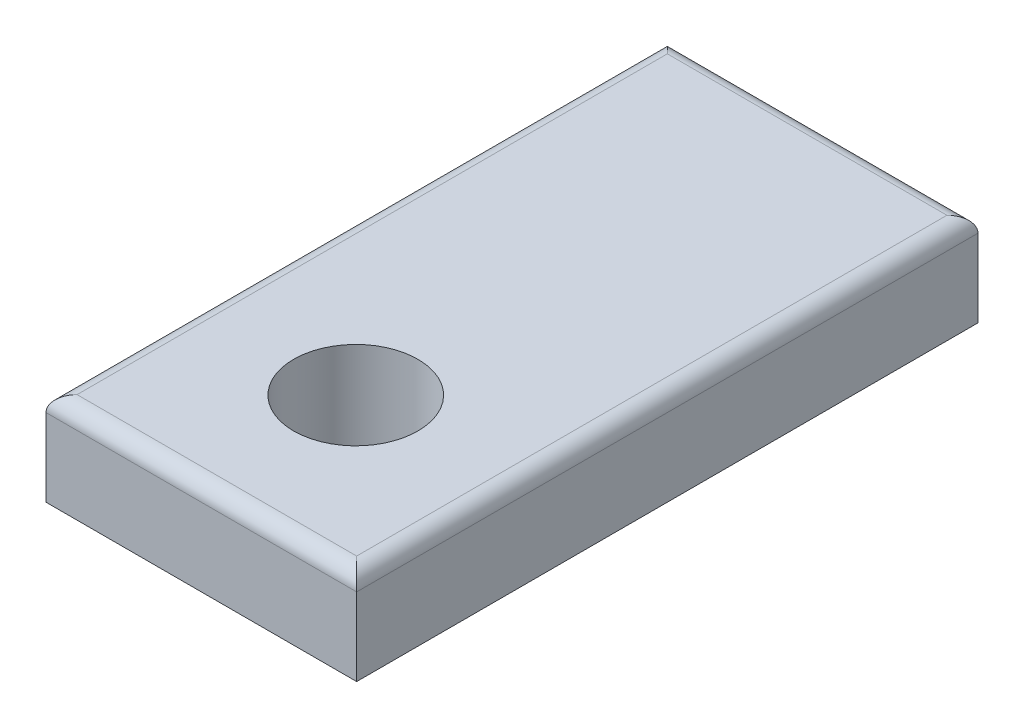
ISO-10303-21;
HEADER;
FILE_DESCRIPTION(('STEP AP214'),'2;1');
FILE_NAME('part.step','',(''),(''),'','','');
FILE_SCHEMA(('AUTOMOTIVE_DESIGN { 1 0 10303 214 1 1 1 1 }'));
ENDSEC;
DATA;
#1=APPLICATION_CONTEXT('core data for automotive mechanical design processes');
#2=APPLICATION_PROTOCOL_DEFINITION('international standard','automotive_design',2000,#1);
#3=PRODUCT_CONTEXT('',#1,'mechanical');
#4=PRODUCT('Part','Part','',(#3));
#5=PRODUCT_RELATED_PRODUCT_CATEGORY('part','',(#4));
#6=PRODUCT_DEFINITION_FORMATION('','',#4);
#7=PRODUCT_DEFINITION_CONTEXT('part definition',#1,'design');
#8=PRODUCT_DEFINITION('design','',#6,#7);
#9=PRODUCT_DEFINITION_SHAPE('','',#8);
#10=(LENGTH_UNIT() NAMED_UNIT(*) SI_UNIT(.MILLI.,.METRE.));
#11=(NAMED_UNIT(*) PLANE_ANGLE_UNIT() SI_UNIT($,.RADIAN.));
#12=(NAMED_UNIT(*) SI_UNIT($,.STERADIAN.) SOLID_ANGLE_UNIT());
#13=UNCERTAINTY_MEASURE_WITH_UNIT(LENGTH_MEASURE(1.E-05),#10,'distance_accuracy_value','');
#14=(GEOMETRIC_REPRESENTATION_CONTEXT(3) GLOBAL_UNCERTAINTY_ASSIGNED_CONTEXT((#13)) GLOBAL_UNIT_ASSIGNED_CONTEXT((#10,
#11,#12)) REPRESENTATION_CONTEXT('',''));
#15=CARTESIAN_POINT('',(0.,0.,0.));
#16=DIRECTION('',(0.,0.,1.));
#17=DIRECTION('',(1.,0.,0.));
#18=AXIS2_PLACEMENT_3D('',#15,#16,#17);
#19=CARTESIAN_POINT('',(5.,3.,10.));
#20=DIRECTION('',(-1.,0.,0.));
#21=DIRECTION('',(0.,0.,1.));
#22=AXIS2_PLACEMENT_3D('',#19,#20,#21);
#23=PLANE('',#22);
#24=DIRECTION('',(0.,-1.,0.));
#25=VECTOR('',#24,1.);
#26=CARTESIAN_POINT('',(5.,3.,-10.));
#27=LINE('',#26,#25);
#28=CARTESIAN_POINT('',(5.,2.5,-10.));
#29=VERTEX_POINT('',#28);
#30=CARTESIAN_POINT('',(5.,0.,-10.));
#31=VERTEX_POINT('',#30);
#32=EDGE_CURVE('E94',#29,#31,#27,.T.);
#33=ORIENTED_EDGE('',*,*,#32,.F.);
#34=DIRECTION('',(0.,0.,-1.));
#35=VECTOR('',#34,1.);
#36=CARTESIAN_POINT('',(5.,2.5,10.));
#37=LINE('',#36,#35);
#38=CARTESIAN_POINT('',(5.,2.5,10.));
#39=VERTEX_POINT('',#38);
#40=EDGE_CURVE('E64',#29,#39,#37,.F.);
#41=ORIENTED_EDGE('',*,*,#40,.T.);
#42=DIRECTION('',(0.,-1.,0.));
#43=VECTOR('',#42,1.);
#44=CARTESIAN_POINT('',(5.,3.,10.));
#45=LINE('',#44,#43);
#46=CARTESIAN_POINT('',(5.,0.,10.));
#47=VERTEX_POINT('',#46);
#48=EDGE_CURVE('E116',#39,#47,#45,.T.);
#49=ORIENTED_EDGE('',*,*,#48,.T.);
#50=DIRECTION('',(0.,0.,-1.));
#51=VECTOR('',#50,1.);
#52=CARTESIAN_POINT('',(5.,0.,10.));
#53=LINE('',#52,#51);
#54=EDGE_CURVE('E111',#47,#31,#53,.T.);
#55=ORIENTED_EDGE('',*,*,#54,.T.);
#56=EDGE_LOOP('',(#33,#41,#49,#55));
#57=FACE_BOUND('',#56,.T.);
#58=ADVANCED_FACE('F39',(#57),#23,.F.);
#59=CARTESIAN_POINT('',(-5.,3.,-10.));
#60=DIRECTION('',(0.,0.,1.));
#61=DIRECTION('',(1.,0.,0.));
#62=AXIS2_PLACEMENT_3D('',#59,#60,#61);
#63=PLANE('',#62);
#64=DIRECTION('',(0.,-1.,0.));
#65=VECTOR('',#64,1.);
#66=CARTESIAN_POINT('',(-5.,3.,-10.));
#67=LINE('',#66,#65);
#68=CARTESIAN_POINT('',(-5.,2.5,-10.));
#69=VERTEX_POINT('',#68);
#70=CARTESIAN_POINT('',(-5.,0.,-10.));
#71=VERTEX_POINT('',#70);
#72=EDGE_CURVE('E105',#69,#71,#67,.T.);
#73=ORIENTED_EDGE('',*,*,#72,.F.);
#74=DIRECTION('',(-1.,0.,0.));
#75=VECTOR('',#74,1.);
#76=CARTESIAN_POINT('',(-5.,2.5,-10.));
#77=LINE('',#76,#75);
#78=EDGE_CURVE('E101',#69,#29,#77,.F.);
#79=ORIENTED_EDGE('',*,*,#78,.T.);
#80=ORIENTED_EDGE('',*,*,#32,.T.);
#81=DIRECTION('',(-1.,0.,0.));
#82=VECTOR('',#81,1.);
#83=CARTESIAN_POINT('',(-5.,0.,-10.));
#84=LINE('',#83,#82);
#85=EDGE_CURVE('E98',#31,#71,#84,.T.);
#86=ORIENTED_EDGE('',*,*,#85,.T.);
#87=EDGE_LOOP('',(#73,#79,#80,#86));
#88=FACE_BOUND('',#87,.T.);
#89=ADVANCED_FACE('F97',(#88),#63,.F.);
#90=CARTESIAN_POINT('',(-5.,3.,10.));
#91=DIRECTION('',(1.,0.,0.));
#92=DIRECTION('',(0.,0.,-1.));
#93=AXIS2_PLACEMENT_3D('',#90,#91,#92);
#94=PLANE('',#93);
#95=DIRECTION('',(0.,-1.,0.));
#96=VECTOR('',#95,1.);
#97=CARTESIAN_POINT('',(-5.,3.,10.));
#98=LINE('',#97,#96);
#99=CARTESIAN_POINT('',(-5.,2.5,10.));
#100=VERTEX_POINT('',#99);
#101=CARTESIAN_POINT('',(-5.,0.,10.));
#102=VERTEX_POINT('',#101);
#103=EDGE_CURVE('E134',#100,#102,#98,.T.);
#104=ORIENTED_EDGE('',*,*,#103,.F.);
#105=DIRECTION('',(0.,0.,1.));
#106=VECTOR('',#105,1.);
#107=CARTESIAN_POINT('',(-5.,2.5,10.));
#108=LINE('',#107,#106);
#109=EDGE_CURVE('E11',#100,#69,#108,.F.);
#110=ORIENTED_EDGE('',*,*,#109,.T.);
#111=ORIENTED_EDGE('',*,*,#72,.T.);
#112=DIRECTION('',(0.,0.,1.));
#113=VECTOR('',#112,1.);
#114=CARTESIAN_POINT('',(-5.,0.,10.));
#115=LINE('',#114,#113);
#116=EDGE_CURVE('E113',#71,#102,#115,.T.);
#117=ORIENTED_EDGE('',*,*,#116,.T.);
#118=EDGE_LOOP('',(#104,#110,#111,#117));
#119=FACE_BOUND('',#118,.T.);
#120=ADVANCED_FACE('F191',(#119),#94,.F.);
#121=CARTESIAN_POINT('',(-5.,3.,10.));
#122=DIRECTION('',(0.,0.,-1.));
#123=DIRECTION('',(-1.,0.,0.));
#124=AXIS2_PLACEMENT_3D('',#121,#122,#123);
#125=PLANE('',#124);
#126=ORIENTED_EDGE('',*,*,#48,.F.);
#127=DIRECTION('',(1.,0.,0.));
#128=VECTOR('',#127,1.);
#129=CARTESIAN_POINT('',(-5.,2.5,10.));
#130=LINE('',#129,#128);
#131=EDGE_CURVE('E49',#39,#100,#130,.F.);
#132=ORIENTED_EDGE('',*,*,#131,.T.);
#133=ORIENTED_EDGE('',*,*,#103,.T.);
#134=DIRECTION('',(1.,0.,0.));
#135=VECTOR('',#134,1.);
#136=CARTESIAN_POINT('',(-5.,0.,10.));
#137=LINE('',#136,#135);
#138=EDGE_CURVE('E129',#102,#47,#137,.T.);
#139=ORIENTED_EDGE('',*,*,#138,.T.);
#140=EDGE_LOOP('',(#126,#132,#133,#139));
#141=FACE_BOUND('',#140,.T.);
#142=ADVANCED_FACE('F182',(#141),#125,.F.);
#143=CARTESIAN_POINT('',(0.,3.,0.));
#144=DIRECTION('',(0.,-1.,0.));
#145=DIRECTION('',(0.,0.,-1.));
#146=AXIS2_PLACEMENT_3D('',#143,#144,#145);
#147=PLANE('',#146);
#148=DIRECTION('',(0.,0.,-1.));
#149=VECTOR('',#148,1.);
#150=CARTESIAN_POINT('',(4.5,3.,0.));
#151=LINE('',#150,#149);
#152=CARTESIAN_POINT('',(4.5,3.,9.5));
#153=VERTEX_POINT('',#152);
#154=CARTESIAN_POINT('',(4.5,3.,-9.5));
#155=VERTEX_POINT('',#154);
#156=EDGE_CURVE('E144',#153,#155,#151,.T.);
#157=ORIENTED_EDGE('',*,*,#156,.T.);
#158=DIRECTION('',(-1.,0.,0.));
#159=VECTOR('',#158,1.);
#160=CARTESIAN_POINT('',(0.,3.,-9.5));
#161=LINE('',#160,#159);
#162=CARTESIAN_POINT('',(-4.5,3.,-9.5));
#163=VERTEX_POINT('',#162);
#164=EDGE_CURVE('E147',#155,#163,#161,.T.);
#165=ORIENTED_EDGE('',*,*,#164,.T.);
#166=DIRECTION('',(0.,0.,1.));
#167=VECTOR('',#166,1.);
#168=CARTESIAN_POINT('',(-4.5,3.,0.));
#169=LINE('',#168,#167);
#170=CARTESIAN_POINT('',(-4.5,3.,9.5));
#171=VERTEX_POINT('',#170);
#172=EDGE_CURVE('E104',#163,#171,#169,.T.);
#173=ORIENTED_EDGE('',*,*,#172,.T.);
#174=DIRECTION('',(1.,0.,0.));
#175=VECTOR('',#174,1.);
#176=CARTESIAN_POINT('',(0.,3.,9.5));
#177=LINE('',#176,#175);
#178=EDGE_CURVE('E141',#171,#153,#177,.T.);
#179=ORIENTED_EDGE('',*,*,#178,.T.);
#180=EDGE_LOOP('',(#157,#165,#173,#179));
#181=FACE_BOUND('',#180,.T.);
#182=CARTESIAN_POINT('',(0.,3.,5.02894769734829));
#183=DIRECTION('',(0.,1.,0.));
#184=DIRECTION('',(0.,0.,1.));
#185=AXIS2_PLACEMENT_3D('',#182,#183,#184);
#186=CIRCLE('',#185,2.);
#187=CARTESIAN_POINT('',(0.,3.,7.02894769734829));
#188=VERTEX_POINT('',#187);
#189=EDGE_CURVE('E123',#188,#188,#186,.T.);
#190=ORIENTED_EDGE('',*,*,#189,.F.);
#191=EDGE_LOOP('',(#190));
#192=FACE_BOUND('',#191,.T.);
#193=ADVANCED_FACE('F180',(#181,#192),#147,.F.);
#194=CARTESIAN_POINT('',(0.,0.,0.));
#195=DIRECTION('',(0.,-1.,0.));
#196=DIRECTION('',(0.,0.,-1.));
#197=AXIS2_PLACEMENT_3D('',#194,#195,#196);
#198=PLANE('',#197);
#199=CARTESIAN_POINT('',(0.,0.,5.02894769734829));
#200=DIRECTION('',(0.,1.,0.));
#201=DIRECTION('',(0.,0.,1.));
#202=AXIS2_PLACEMENT_3D('',#199,#200,#201);
#203=CIRCLE('',#202,2.);
#204=CARTESIAN_POINT('',(0.,0.,7.02894769734829));
#205=VERTEX_POINT('',#204);
#206=EDGE_CURVE('E119',#205,#205,#203,.T.);
#207=ORIENTED_EDGE('',*,*,#206,.T.);
#208=EDGE_LOOP('',(#207));
#209=FACE_BOUND('',#208,.T.);
#210=ORIENTED_EDGE('',*,*,#54,.F.);
#211=ORIENTED_EDGE('',*,*,#138,.F.);
#212=ORIENTED_EDGE('',*,*,#116,.F.);
#213=ORIENTED_EDGE('',*,*,#85,.F.);
#214=EDGE_LOOP('',(#210,#211,#212,#213));
#215=FACE_BOUND('',#214,.T.);
#216=ADVANCED_FACE('F109',(#209,#215),#198,.T.);
#217=CARTESIAN_POINT('',(0.,0.,5.02894769734829));
#218=DIRECTION('',(0.,1.,0.));
#219=DIRECTION('',(0.,0.,1.));
#220=AXIS2_PLACEMENT_3D('',#217,#218,#219);
#221=CYLINDRICAL_SURFACE('',#220,2.);
#222=ORIENTED_EDGE('',*,*,#206,.F.);
#223=EDGE_LOOP('',(#222));
#224=FACE_BOUND('',#223,.T.);
#225=ORIENTED_EDGE('',*,*,#189,.T.);
#226=EDGE_LOOP('',(#225));
#227=FACE_BOUND('',#226,.T.);
#228=ADVANCED_FACE('F178',(#224,#227),#221,.F.);
#229=CARTESIAN_POINT('',(0.,2.5,9.5));
#230=DIRECTION('',(1.,0.,0.));
#231=DIRECTION('',(0.,0.,-1.));
#232=AXIS2_PLACEMENT_3D('',#229,#230,#231);
#233=CYLINDRICAL_SURFACE('',#232,0.5);
#234=CARTESIAN_POINT('',(-4.5,2.5,9.5));
#235=DIRECTION('',(0.707106781186547,0.,0.707106781186547));
#236=DIRECTION('',(-0.707106781186547,0.,0.707106781186547));
#237=AXIS2_PLACEMENT_3D('',#234,#235,#236);
#238=ELLIPSE('',#237,0.707106781186547,0.5);
#239=EDGE_CURVE('E162',#100,#171,#238,.F.);
#240=ORIENTED_EDGE('',*,*,#239,.F.);
#241=ORIENTED_EDGE('',*,*,#131,.F.);
#242=CARTESIAN_POINT('',(4.5,2.5,9.5));
#243=DIRECTION('',(0.707106781186547,0.,-0.707106781186547));
#244=DIRECTION('',(0.707106781186547,0.,0.707106781186547));
#245=AXIS2_PLACEMENT_3D('',#242,#243,#244);
#246=ELLIPSE('',#245,0.707106781186547,0.5);
#247=EDGE_CURVE('E43',#153,#39,#246,.T.);
#248=ORIENTED_EDGE('',*,*,#247,.F.);
#249=ORIENTED_EDGE('',*,*,#178,.F.);
#250=EDGE_LOOP('',(#240,#241,#248,#249));
#251=FACE_BOUND('',#250,.T.);
#252=ADVANCED_FACE('F41',(#251),#233,.T.);
#253=CARTESIAN_POINT('',(4.5,2.5,0.));
#254=DIRECTION('',(0.,0.,-1.));
#255=DIRECTION('',(-1.,0.,0.));
#256=AXIS2_PLACEMENT_3D('',#253,#254,#255);
#257=CYLINDRICAL_SURFACE('',#256,0.5);
#258=ORIENTED_EDGE('',*,*,#247,.T.);
#259=ORIENTED_EDGE('',*,*,#40,.F.);
#260=CARTESIAN_POINT('',(4.5,2.5,-9.5));
#261=DIRECTION('',(-0.707106781186547,0.,-0.707106781186547));
#262=DIRECTION('',(0.707106781186547,0.,-0.707106781186547));
#263=AXIS2_PLACEMENT_3D('',#260,#261,#262);
#264=ELLIPSE('',#263,0.707106781186547,0.5);
#265=EDGE_CURVE('E160',#155,#29,#264,.T.);
#266=ORIENTED_EDGE('',*,*,#265,.F.);
#267=ORIENTED_EDGE('',*,*,#156,.F.);
#268=EDGE_LOOP('',(#258,#259,#266,#267));
#269=FACE_BOUND('',#268,.T.);
#270=ADVANCED_FACE('F208',(#269),#257,.T.);
#271=CARTESIAN_POINT('',(-4.5,2.5,0.));
#272=DIRECTION('',(0.,0.,1.));
#273=DIRECTION('',(1.,0.,0.));
#274=AXIS2_PLACEMENT_3D('',#271,#272,#273);
#275=CYLINDRICAL_SURFACE('',#274,0.5);
#276=ORIENTED_EDGE('',*,*,#239,.T.);
#277=ORIENTED_EDGE('',*,*,#172,.F.);
#278=CARTESIAN_POINT('',(-4.5,2.5,-9.5));
#279=DIRECTION('',(-0.707106781186547,0.,0.707106781186547));
#280=DIRECTION('',(0.707106781186547,0.,0.707106781186547));
#281=AXIS2_PLACEMENT_3D('',#278,#279,#280);
#282=ELLIPSE('',#281,0.707106781186547,0.5);
#283=EDGE_CURVE('E157',#69,#163,#282,.F.);
#284=ORIENTED_EDGE('',*,*,#283,.F.);
#285=ORIENTED_EDGE('',*,*,#109,.F.);
#286=EDGE_LOOP('',(#276,#277,#284,#285));
#287=FACE_BOUND('',#286,.T.);
#288=ADVANCED_FACE('F205',(#287),#275,.T.);
#289=CARTESIAN_POINT('',(0.,2.5,-9.5));
#290=DIRECTION('',(-1.,0.,0.));
#291=DIRECTION('',(0.,0.,1.));
#292=AXIS2_PLACEMENT_3D('',#289,#290,#291);
#293=CYLINDRICAL_SURFACE('',#292,0.5);
#294=ORIENTED_EDGE('',*,*,#265,.T.);
#295=ORIENTED_EDGE('',*,*,#78,.F.);
#296=ORIENTED_EDGE('',*,*,#283,.T.);
#297=ORIENTED_EDGE('',*,*,#164,.F.);
#298=EDGE_LOOP('',(#294,#295,#296,#297));
#299=FACE_BOUND('',#298,.T.);
#300=ADVANCED_FACE('F202',(#299),#293,.T.);
#301=CLOSED_SHELL('',(#58,#89,#120,#142,#193,#216,#228,#252,#270,#288,#300));
#302=MANIFOLD_SOLID_BREP('B2',#301);
#303=ADVANCED_BREP_SHAPE_REPRESENTATION('',(#18,#302),#14);
#304=SHAPE_DEFINITION_REPRESENTATION(#9,#303);
ENDSEC;
END-ISO-10303-21;
